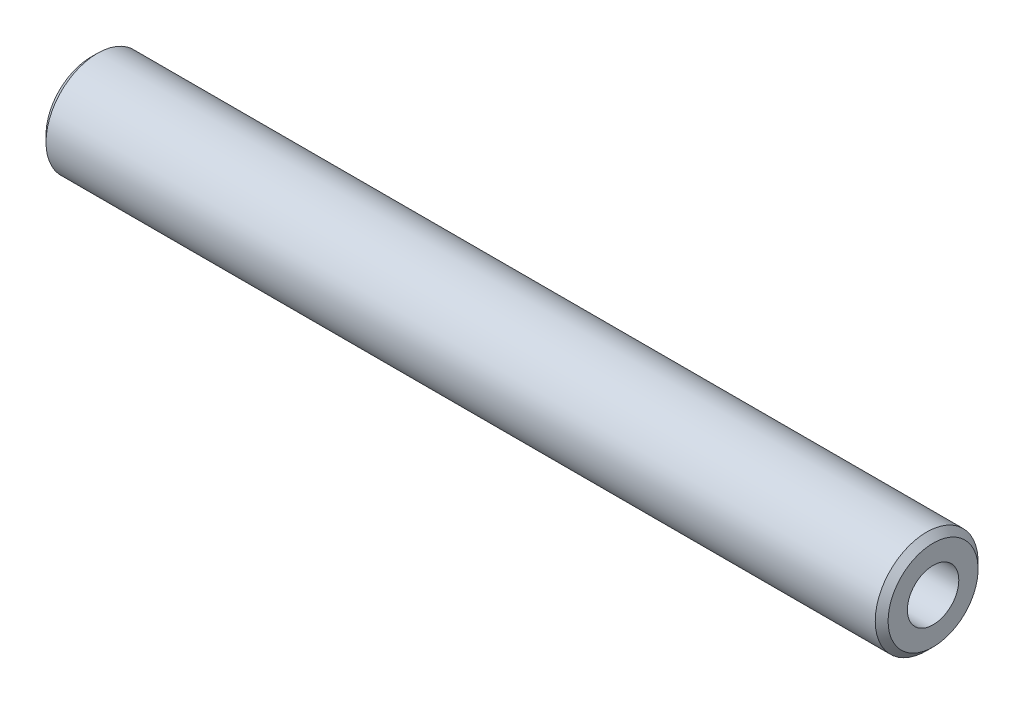
ISO-10303-21;
HEADER;
FILE_DESCRIPTION(('STEP AP214'),'2;1');
FILE_NAME('part.step','',(''),(''),'','','');
FILE_SCHEMA(('AUTOMOTIVE_DESIGN { 1 0 10303 214 1 1 1 1 }'));
ENDSEC;
DATA;
#1=APPLICATION_CONTEXT('core data for automotive mechanical design processes');
#2=APPLICATION_PROTOCOL_DEFINITION('international standard','automotive_design',2000,#1);
#3=PRODUCT_CONTEXT('',#1,'mechanical');
#4=PRODUCT('Part','Part','',(#3));
#5=PRODUCT_RELATED_PRODUCT_CATEGORY('part','',(#4));
#6=PRODUCT_DEFINITION_FORMATION('','',#4);
#7=PRODUCT_DEFINITION_CONTEXT('part definition',#1,'design');
#8=PRODUCT_DEFINITION('design','',#6,#7);
#9=PRODUCT_DEFINITION_SHAPE('','',#8);
#10=(LENGTH_UNIT() NAMED_UNIT(*) SI_UNIT(.MILLI.,.METRE.));
#11=(NAMED_UNIT(*) PLANE_ANGLE_UNIT() SI_UNIT($,.RADIAN.));
#12=(NAMED_UNIT(*) SI_UNIT($,.STERADIAN.) SOLID_ANGLE_UNIT());
#13=UNCERTAINTY_MEASURE_WITH_UNIT(LENGTH_MEASURE(1.E-05),#10,'distance_accuracy_value','');
#14=(GEOMETRIC_REPRESENTATION_CONTEXT(3) GLOBAL_UNCERTAINTY_ASSIGNED_CONTEXT((#13)) GLOBAL_UNIT_ASSIGNED_CONTEXT((#10,
#11,#12)) REPRESENTATION_CONTEXT('',''));
#15=CARTESIAN_POINT('',(0.,0.,0.));
#16=DIRECTION('',(0.,0.,1.));
#17=DIRECTION('',(1.,0.,0.));
#18=AXIS2_PLACEMENT_3D('',#15,#16,#17);
#19=CARTESIAN_POINT('',(-32.75,0.,0.));
#20=DIRECTION('',(1.,0.,0.));
#21=DIRECTION('',(0.,0.,-1.));
#22=AXIS2_PLACEMENT_3D('',#19,#20,#21);
#23=PLANE('',#22);
#24=CARTESIAN_POINT('',(-32.75,0.,0.));
#25=DIRECTION('',(1.,0.,0.));
#26=DIRECTION('',(0.,0.,-1.));
#27=AXIS2_PLACEMENT_3D('',#24,#25,#26);
#28=CIRCLE('',#27,3.49999999999999);
#29=CARTESIAN_POINT('',(-32.75,0.,-3.49999999999999));
#30=VERTEX_POINT('',#29);
#31=EDGE_CURVE('E77',#30,#30,#28,.F.);
#32=ORIENTED_EDGE('',*,*,#31,.T.);
#33=EDGE_LOOP('',(#32));
#34=FACE_BOUND('',#33,.T.);
#35=CARTESIAN_POINT('',(-32.75,0.,0.));
#36=DIRECTION('',(-1.,0.,0.));
#37=DIRECTION('',(0.,0.,1.));
#38=AXIS2_PLACEMENT_3D('',#35,#36,#37);
#39=CIRCLE('',#38,2.);
#40=CARTESIAN_POINT('',(-32.75,0.,2.));
#41=VERTEX_POINT('',#40);
#42=EDGE_CURVE('E58',#41,#41,#39,.T.);
#43=ORIENTED_EDGE('',*,*,#42,.F.);
#44=EDGE_LOOP('',(#43));
#45=FACE_BOUND('',#44,.T.);
#46=ADVANCED_FACE('F34',(#34,#45),#23,.F.);
#47=CARTESIAN_POINT('',(0.,0.,0.));
#48=DIRECTION('',(-1.,0.,0.));
#49=DIRECTION('',(0.,0.,1.));
#50=AXIS2_PLACEMENT_3D('',#47,#48,#49);
#51=CYLINDRICAL_SURFACE('',#50,4.00000000000001);
#52=CARTESIAN_POINT('',(-32.25,0.,0.));
#53=DIRECTION('',(1.,0.,0.));
#54=DIRECTION('',(0.,0.,-1.));
#55=AXIS2_PLACEMENT_3D('',#52,#53,#54);
#56=CIRCLE('',#55,4.00000000000001);
#57=CARTESIAN_POINT('',(-32.25,0.,-4.00000000000001));
#58=VERTEX_POINT('',#57);
#59=EDGE_CURVE('E42',#58,#58,#56,.T.);
#60=ORIENTED_EDGE('',*,*,#59,.T.);
#61=EDGE_LOOP('',(#60));
#62=FACE_BOUND('',#61,.T.);
#63=CARTESIAN_POINT('',(32.25,0.,0.));
#64=DIRECTION('',(-1.,0.,0.));
#65=DIRECTION('',(0.,0.,1.));
#66=AXIS2_PLACEMENT_3D('',#63,#64,#65);
#67=CIRCLE('',#66,4.00000000000001);
#68=CARTESIAN_POINT('',(32.25,0.,4.00000000000001));
#69=VERTEX_POINT('',#68);
#70=EDGE_CURVE('E80',#69,#69,#67,.T.);
#71=ORIENTED_EDGE('',*,*,#70,.T.);
#72=EDGE_LOOP('',(#71));
#73=FACE_BOUND('',#72,.T.);
#74=ADVANCED_FACE('F85',(#62,#73),#51,.T.);
#75=CARTESIAN_POINT('',(32.75,0.,0.));
#76=DIRECTION('',(-1.,0.,0.));
#77=DIRECTION('',(0.,0.,1.));
#78=AXIS2_PLACEMENT_3D('',#75,#76,#77);
#79=PLANE('',#78);
#80=CARTESIAN_POINT('',(32.75,0.,0.));
#81=DIRECTION('',(-1.,0.,0.));
#82=DIRECTION('',(0.,0.,1.));
#83=AXIS2_PLACEMENT_3D('',#80,#81,#82);
#84=CIRCLE('',#83,3.50000000000001);
#85=CARTESIAN_POINT('',(32.75,0.,3.50000000000001));
#86=VERTEX_POINT('',#85);
#87=EDGE_CURVE('E11',#86,#86,#84,.F.);
#88=ORIENTED_EDGE('',*,*,#87,.T.);
#89=EDGE_LOOP('',(#88));
#90=FACE_BOUND('',#89,.T.);
#91=CARTESIAN_POINT('',(32.75,0.,0.));
#92=DIRECTION('',(1.,0.,0.));
#93=DIRECTION('',(0.,0.,-1.));
#94=AXIS2_PLACEMENT_3D('',#91,#92,#93);
#95=CIRCLE('',#94,2.);
#96=CARTESIAN_POINT('',(32.75,0.,-2.));
#97=VERTEX_POINT('',#96);
#98=EDGE_CURVE('E219',#97,#97,#95,.T.);
#99=ORIENTED_EDGE('',*,*,#98,.F.);
#100=EDGE_LOOP('',(#99));
#101=FACE_BOUND('',#100,.T.);
#102=ADVANCED_FACE('F118',(#90,#101),#79,.F.);
#103=CARTESIAN_POINT('',(-21.25,0.,0.));
#104=DIRECTION('',(-1.,0.,0.));
#105=DIRECTION('',(0.,0.,1.));
#106=AXIS2_PLACEMENT_3D('',#103,#104,#105);
#107=CONICAL_SURFACE('',#106,1.65,1.02974425867665);
#108=CARTESIAN_POINT('',(-20.2585799786045,0.,0.));
#109=VERTEX_POINT('',#108);
#110=VERTEX_LOOP('',#109);
#111=FACE_BOUND('',#110,.T.);
#112=CARTESIAN_POINT('',(-21.25,0.,0.));
#113=DIRECTION('',(-1.,0.,0.));
#114=DIRECTION('',(0.,0.,1.));
#115=AXIS2_PLACEMENT_3D('',#112,#113,#114);
#116=CIRCLE('',#115,1.65);
#117=CARTESIAN_POINT('',(-21.25,0.,1.65));
#118=VERTEX_POINT('',#117);
#119=EDGE_CURVE('E74',#118,#118,#116,.T.);
#120=ORIENTED_EDGE('',*,*,#119,.T.);
#121=EDGE_LOOP('',(#120));
#122=FACE_BOUND('',#121,.T.);
#123=ADVANCED_FACE('F114',(#111,#122),#107,.F.);
#124=CARTESIAN_POINT('',(-32.75,0.,0.));
#125=DIRECTION('',(-1.,0.,0.));
#126=DIRECTION('',(0.,0.,1.));
#127=AXIS2_PLACEMENT_3D('',#124,#125,#126);
#128=CYLINDRICAL_SURFACE('',#127,1.65);
#129=ORIENTED_EDGE('',*,*,#119,.F.);
#130=EDGE_LOOP('',(#129));
#131=FACE_BOUND('',#130,.T.);
#132=CARTESIAN_POINT('',(-24.75,0.,0.));
#133=DIRECTION('',(-1.,0.,0.));
#134=DIRECTION('',(0.,0.,1.));
#135=AXIS2_PLACEMENT_3D('',#132,#133,#134);
#136=CIRCLE('',#135,1.65);
#137=CARTESIAN_POINT('',(-24.75,0.,1.65));
#138=VERTEX_POINT('',#137);
#139=EDGE_CURVE('E71',#138,#138,#136,.T.);
#140=ORIENTED_EDGE('',*,*,#139,.T.);
#141=EDGE_LOOP('',(#140));
#142=FACE_BOUND('',#141,.T.);
#143=ADVANCED_FACE('F106',(#131,#142),#128,.F.);
#144=CARTESIAN_POINT('',(-24.75,1.65,0.));
#145=DIRECTION('',(1.,0.,0.));
#146=DIRECTION('',(0.,0.,-1.));
#147=AXIS2_PLACEMENT_3D('',#144,#145,#146);
#148=PLANE('',#147);
#149=ORIENTED_EDGE('',*,*,#139,.F.);
#150=EDGE_LOOP('',(#149));
#151=FACE_BOUND('',#150,.T.);
#152=CARTESIAN_POINT('',(-24.75,0.,0.));
#153=DIRECTION('',(-1.,0.,0.));
#154=DIRECTION('',(0.,0.,1.));
#155=AXIS2_PLACEMENT_3D('',#152,#153,#154);
#156=CIRCLE('',#155,2.);
#157=CARTESIAN_POINT('',(-24.75,0.,2.));
#158=VERTEX_POINT('',#157);
#159=EDGE_CURVE('E62',#158,#158,#156,.T.);
#160=ORIENTED_EDGE('',*,*,#159,.T.);
#161=EDGE_LOOP('',(#160));
#162=FACE_BOUND('',#161,.T.);
#163=ADVANCED_FACE('F100',(#151,#162),#148,.F.);
#164=CARTESIAN_POINT('',(-32.75,0.,0.));
#165=DIRECTION('',(-1.,0.,0.));
#166=DIRECTION('',(0.,0.,1.));
#167=AXIS2_PLACEMENT_3D('',#164,#165,#166);
#168=CYLINDRICAL_SURFACE('',#167,2.);
#169=ORIENTED_EDGE('',*,*,#159,.F.);
#170=EDGE_LOOP('',(#169));
#171=FACE_BOUND('',#170,.T.);
#172=ORIENTED_EDGE('',*,*,#42,.T.);
#173=EDGE_LOOP('',(#172));
#174=FACE_BOUND('',#173,.T.);
#175=ADVANCED_FACE('F52',(#171,#174),#168,.F.);
#176=CARTESIAN_POINT('',(21.25,0.,0.));
#177=DIRECTION('',(1.,0.,0.));
#178=DIRECTION('',(0.,0.,-1.));
#179=AXIS2_PLACEMENT_3D('',#176,#177,#178);
#180=CONICAL_SURFACE('',#179,1.65,1.02974425867665);
#181=CARTESIAN_POINT('',(20.2585799786045,0.,0.));
#182=VERTEX_POINT('',#181);
#183=VERTEX_LOOP('',#182);
#184=FACE_BOUND('',#183,.T.);
#185=CARTESIAN_POINT('',(21.25,0.,0.));
#186=DIRECTION('',(1.,0.,0.));
#187=DIRECTION('',(0.,0.,-1.));
#188=AXIS2_PLACEMENT_3D('',#185,#186,#187);
#189=CIRCLE('',#188,1.65);
#190=CARTESIAN_POINT('',(21.25,0.,-1.65));
#191=VERTEX_POINT('',#190);
#192=EDGE_CURVE('E56',#191,#191,#189,.T.);
#193=ORIENTED_EDGE('',*,*,#192,.T.);
#194=EDGE_LOOP('',(#193));
#195=FACE_BOUND('',#194,.T.);
#196=ADVANCED_FACE('F48',(#184,#195),#180,.F.);
#197=CARTESIAN_POINT('',(32.75,0.,0.));
#198=DIRECTION('',(1.,0.,0.));
#199=DIRECTION('',(0.,0.,-1.));
#200=AXIS2_PLACEMENT_3D('',#197,#198,#199);
#201=CYLINDRICAL_SURFACE('',#200,1.65);
#202=ORIENTED_EDGE('',*,*,#192,.F.);
#203=EDGE_LOOP('',(#202));
#204=FACE_BOUND('',#203,.T.);
#205=CARTESIAN_POINT('',(24.75,0.,0.));
#206=DIRECTION('',(1.,0.,0.));
#207=DIRECTION('',(0.,0.,-1.));
#208=AXIS2_PLACEMENT_3D('',#205,#206,#207);
#209=CIRCLE('',#208,1.65);
#210=CARTESIAN_POINT('',(24.75,0.,-1.65));
#211=VERTEX_POINT('',#210);
#212=EDGE_CURVE('E59',#211,#211,#209,.T.);
#213=ORIENTED_EDGE('',*,*,#212,.T.);
#214=EDGE_LOOP('',(#213));
#215=FACE_BOUND('',#214,.T.);
#216=ADVANCED_FACE('F51',(#204,#215),#201,.F.);
#217=CARTESIAN_POINT('',(24.75,1.65,0.));
#218=DIRECTION('',(-1.,0.,0.));
#219=DIRECTION('',(0.,0.,1.));
#220=AXIS2_PLACEMENT_3D('',#217,#218,#219);
#221=PLANE('',#220);
#222=ORIENTED_EDGE('',*,*,#212,.F.);
#223=EDGE_LOOP('',(#222));
#224=FACE_BOUND('',#223,.T.);
#225=CARTESIAN_POINT('',(24.75,0.,0.));
#226=DIRECTION('',(1.,0.,0.));
#227=DIRECTION('',(0.,0.,-1.));
#228=AXIS2_PLACEMENT_3D('',#225,#226,#227);
#229=CIRCLE('',#228,2.);
#230=CARTESIAN_POINT('',(24.75,0.,-2.));
#231=VERTEX_POINT('',#230);
#232=EDGE_CURVE('E65',#231,#231,#229,.T.);
#233=ORIENTED_EDGE('',*,*,#232,.T.);
#234=EDGE_LOOP('',(#233));
#235=FACE_BOUND('',#234,.T.);
#236=ADVANCED_FACE('F166',(#224,#235),#221,.F.);
#237=CARTESIAN_POINT('',(32.75,0.,0.));
#238=DIRECTION('',(1.,0.,0.));
#239=DIRECTION('',(0.,0.,-1.));
#240=AXIS2_PLACEMENT_3D('',#237,#238,#239);
#241=CYLINDRICAL_SURFACE('',#240,2.);
#242=ORIENTED_EDGE('',*,*,#232,.F.);
#243=EDGE_LOOP('',(#242));
#244=FACE_BOUND('',#243,.T.);
#245=ORIENTED_EDGE('',*,*,#98,.T.);
#246=EDGE_LOOP('',(#245));
#247=FACE_BOUND('',#246,.T.);
#248=ADVANCED_FACE('F91',(#244,#247),#241,.F.);
#249=CARTESIAN_POINT('',(-32.75,0.,0.));
#250=DIRECTION('',(1.,0.,0.));
#251=DIRECTION('',(0.,0.,-1.));
#252=AXIS2_PLACEMENT_3D('',#249,#250,#251);
#253=CONICAL_SURFACE('',#252,3.49999999999999,0.785398163397451);
#254=ORIENTED_EDGE('',*,*,#59,.F.);
#255=EDGE_LOOP('',(#254));
#256=FACE_BOUND('',#255,.T.);
#257=ORIENTED_EDGE('',*,*,#31,.F.);
#258=EDGE_LOOP('',(#257));
#259=FACE_BOUND('',#258,.T.);
#260=ADVANCED_FACE('F88',(#256,#259),#253,.T.);
#261=CARTESIAN_POINT('',(32.25,0.,0.));
#262=DIRECTION('',(-1.,0.,0.));
#263=DIRECTION('',(0.,0.,1.));
#264=AXIS2_PLACEMENT_3D('',#261,#262,#263);
#265=CONICAL_SURFACE('',#264,4.00000000000001,0.785398163397444);
#266=ORIENTED_EDGE('',*,*,#87,.F.);
#267=EDGE_LOOP('',(#266));
#268=FACE_BOUND('',#267,.T.);
#269=ORIENTED_EDGE('',*,*,#70,.F.);
#270=EDGE_LOOP('',(#269));
#271=FACE_BOUND('',#270,.T.);
#272=ADVANCED_FACE('F36',(#268,#271),#265,.T.);
#273=CLOSED_SHELL('',(#46,#74,#102,#123,#143,#163,#175,#196,#216,#236,#248,#260,#272));
#274=MANIFOLD_SOLID_BREP('B2',#273);
#275=ADVANCED_BREP_SHAPE_REPRESENTATION('',(#18,#274),#14);
#276=SHAPE_DEFINITION_REPRESENTATION(#9,#275);
ENDSEC;
END-ISO-10303-21;
